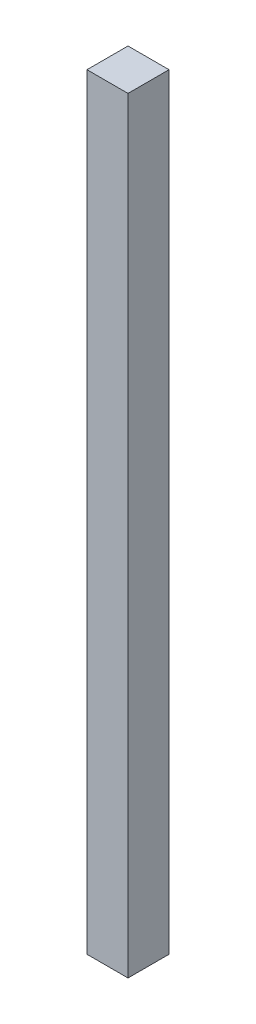
ISO-10303-21;
HEADER;
FILE_DESCRIPTION(('STEP AP214'),'2;1');
FILE_NAME('part.step','',(''),(''),'','','');
FILE_SCHEMA(('AUTOMOTIVE_DESIGN { 1 0 10303 214 1 1 1 1 }'));
ENDSEC;
DATA;
#1=APPLICATION_CONTEXT('core data for automotive mechanical design processes');
#2=APPLICATION_PROTOCOL_DEFINITION('international standard','automotive_design',2000,#1);
#3=PRODUCT_CONTEXT('',#1,'mechanical');
#4=PRODUCT('Part','Part','',(#3));
#5=PRODUCT_RELATED_PRODUCT_CATEGORY('part','',(#4));
#6=PRODUCT_DEFINITION_FORMATION('','',#4);
#7=PRODUCT_DEFINITION_CONTEXT('part definition',#1,'design');
#8=PRODUCT_DEFINITION('design','',#6,#7);
#9=PRODUCT_DEFINITION_SHAPE('','',#8);
#10=(LENGTH_UNIT() NAMED_UNIT(*) SI_UNIT(.MILLI.,.METRE.));
#11=(NAMED_UNIT(*) PLANE_ANGLE_UNIT() SI_UNIT($,.RADIAN.));
#12=(NAMED_UNIT(*) SI_UNIT($,.STERADIAN.) SOLID_ANGLE_UNIT());
#13=UNCERTAINTY_MEASURE_WITH_UNIT(LENGTH_MEASURE(1.E-05),#10,'distance_accuracy_value','');
#14=(GEOMETRIC_REPRESENTATION_CONTEXT(3) GLOBAL_UNCERTAINTY_ASSIGNED_CONTEXT((#13)) GLOBAL_UNIT_ASSIGNED_CONTEXT((#10,
#11,#12)) REPRESENTATION_CONTEXT('',''));
#15=CARTESIAN_POINT('',(0.,0.,0.));
#16=DIRECTION('',(0.,0.,1.));
#17=DIRECTION('',(1.,0.,0.));
#18=AXIS2_PLACEMENT_3D('',#15,#16,#17);
#19=CARTESIAN_POINT('',(-19.05,711.2,19.05));
#20=DIRECTION('',(1.,0.,0.));
#21=DIRECTION('',(0.,0.,-1.));
#22=AXIS2_PLACEMENT_3D('',#19,#20,#21);
#23=PLANE('',#22);
#24=DIRECTION('',(0.,0.,1.));
#25=VECTOR('',#24,1.);
#26=CARTESIAN_POINT('',(-19.05,0.,19.05));
#27=LINE('',#26,#25);
#28=CARTESIAN_POINT('',(-19.05,0.,-19.05));
#29=VERTEX_POINT('',#28);
#30=CARTESIAN_POINT('',(-19.05,0.,19.05));
#31=VERTEX_POINT('',#30);
#32=EDGE_CURVE('E95',#29,#31,#27,.T.);
#33=ORIENTED_EDGE('',*,*,#32,.T.);
#34=DIRECTION('',(0.,-1.,0.));
#35=VECTOR('',#34,1.);
#36=CARTESIAN_POINT('',(-19.05,711.2,19.05));
#37=LINE('',#36,#35);
#38=CARTESIAN_POINT('',(-19.05,711.2,19.05));
#39=VERTEX_POINT('',#38);
#40=EDGE_CURVE('E11',#39,#31,#37,.T.);
#41=ORIENTED_EDGE('',*,*,#40,.F.);
#42=DIRECTION('',(0.,0.,1.));
#43=VECTOR('',#42,1.);
#44=CARTESIAN_POINT('',(-19.05,711.2,19.05));
#45=LINE('',#44,#43);
#46=CARTESIAN_POINT('',(-19.05,711.2,-19.05));
#47=VERTEX_POINT('',#46);
#48=EDGE_CURVE('E83',#47,#39,#45,.T.);
#49=ORIENTED_EDGE('',*,*,#48,.F.);
#50=DIRECTION('',(0.,-1.,0.));
#51=VECTOR('',#50,1.);
#52=CARTESIAN_POINT('',(-19.05,711.2,-19.05));
#53=LINE('',#52,#51);
#54=EDGE_CURVE('E91',#47,#29,#53,.T.);
#55=ORIENTED_EDGE('',*,*,#54,.T.);
#56=EDGE_LOOP('',(#33,#41,#49,#55));
#57=FACE_BOUND('',#56,.T.);
#58=ADVANCED_FACE('F32',(#57),#23,.F.);
#59=CARTESIAN_POINT('',(19.05,711.2,19.05));
#60=DIRECTION('',(0.,0.,-1.));
#61=DIRECTION('',(-1.,0.,0.));
#62=AXIS2_PLACEMENT_3D('',#59,#60,#61);
#63=PLANE('',#62);
#64=DIRECTION('',(1.,0.,0.));
#65=VECTOR('',#64,1.);
#66=CARTESIAN_POINT('',(19.05,0.,19.05));
#67=LINE('',#66,#65);
#68=CARTESIAN_POINT('',(19.05,0.,19.05));
#69=VERTEX_POINT('',#68);
#70=EDGE_CURVE('E87',#31,#69,#67,.T.);
#71=ORIENTED_EDGE('',*,*,#70,.T.);
#72=DIRECTION('',(0.,-1.,0.));
#73=VECTOR('',#72,1.);
#74=CARTESIAN_POINT('',(19.05,711.2,19.05));
#75=LINE('',#74,#73);
#76=CARTESIAN_POINT('',(19.05,711.2,19.05));
#77=VERTEX_POINT('',#76);
#78=EDGE_CURVE('E40',#77,#69,#75,.T.);
#79=ORIENTED_EDGE('',*,*,#78,.F.);
#80=DIRECTION('',(1.,0.,0.));
#81=VECTOR('',#80,1.);
#82=CARTESIAN_POINT('',(19.05,711.2,19.05));
#83=LINE('',#82,#81);
#84=EDGE_CURVE('E78',#39,#77,#83,.T.);
#85=ORIENTED_EDGE('',*,*,#84,.F.);
#86=ORIENTED_EDGE('',*,*,#40,.T.);
#87=EDGE_LOOP('',(#71,#79,#85,#86));
#88=FACE_BOUND('',#87,.T.);
#89=ADVANCED_FACE('F86',(#88),#63,.F.);
#90=CARTESIAN_POINT('',(19.05,711.2,19.05));
#91=DIRECTION('',(-1.,0.,0.));
#92=DIRECTION('',(0.,0.,1.));
#93=AXIS2_PLACEMENT_3D('',#90,#91,#92);
#94=PLANE('',#93);
#95=DIRECTION('',(0.,0.,-1.));
#96=VECTOR('',#95,1.);
#97=CARTESIAN_POINT('',(19.05,0.,19.05));
#98=LINE('',#97,#96);
#99=CARTESIAN_POINT('',(19.05,0.,-19.05));
#100=VERTEX_POINT('',#99);
#101=EDGE_CURVE('E65',#69,#100,#98,.T.);
#102=ORIENTED_EDGE('',*,*,#101,.T.);
#103=DIRECTION('',(0.,-1.,0.));
#104=VECTOR('',#103,1.);
#105=CARTESIAN_POINT('',(19.05,711.2,-19.05));
#106=LINE('',#105,#104);
#107=CARTESIAN_POINT('',(19.05,711.2,-19.05));
#108=VERTEX_POINT('',#107);
#109=EDGE_CURVE('E88',#108,#100,#106,.T.);
#110=ORIENTED_EDGE('',*,*,#109,.F.);
#111=DIRECTION('',(0.,0.,-1.));
#112=VECTOR('',#111,1.);
#113=CARTESIAN_POINT('',(19.05,711.2,19.05));
#114=LINE('',#113,#112);
#115=EDGE_CURVE('E81',#77,#108,#114,.T.);
#116=ORIENTED_EDGE('',*,*,#115,.F.);
#117=ORIENTED_EDGE('',*,*,#78,.T.);
#118=EDGE_LOOP('',(#102,#110,#116,#117));
#119=FACE_BOUND('',#118,.T.);
#120=ADVANCED_FACE('F89',(#119),#94,.F.);
#121=CARTESIAN_POINT('',(19.05,711.2,-19.05));
#122=DIRECTION('',(0.,0.,1.));
#123=DIRECTION('',(1.,0.,0.));
#124=AXIS2_PLACEMENT_3D('',#121,#122,#123);
#125=PLANE('',#124);
#126=DIRECTION('',(-1.,0.,0.));
#127=VECTOR('',#126,1.);
#128=CARTESIAN_POINT('',(19.05,0.,-19.05));
#129=LINE('',#128,#127);
#130=EDGE_CURVE('E71',#100,#29,#129,.T.);
#131=ORIENTED_EDGE('',*,*,#130,.T.);
#132=ORIENTED_EDGE('',*,*,#54,.F.);
#133=DIRECTION('',(-1.,0.,0.));
#134=VECTOR('',#133,1.);
#135=CARTESIAN_POINT('',(19.05,711.2,-19.05));
#136=LINE('',#135,#134);
#137=EDGE_CURVE('E48',#108,#47,#136,.T.);
#138=ORIENTED_EDGE('',*,*,#137,.F.);
#139=ORIENTED_EDGE('',*,*,#109,.T.);
#140=EDGE_LOOP('',(#131,#132,#138,#139));
#141=FACE_BOUND('',#140,.T.);
#142=ADVANCED_FACE('F102',(#141),#125,.F.);
#143=CARTESIAN_POINT('',(0.,711.2,0.));
#144=DIRECTION('',(0.,1.,0.));
#145=DIRECTION('',(0.,0.,1.));
#146=AXIS2_PLACEMENT_3D('',#143,#144,#145);
#147=PLANE('',#146);
#148=ORIENTED_EDGE('',*,*,#48,.T.);
#149=ORIENTED_EDGE('',*,*,#84,.T.);
#150=ORIENTED_EDGE('',*,*,#115,.T.);
#151=ORIENTED_EDGE('',*,*,#137,.T.);
#152=EDGE_LOOP('',(#148,#149,#150,#151));
#153=FACE_BOUND('',#152,.T.);
#154=ADVANCED_FACE('F79',(#153),#147,.T.);
#155=CARTESIAN_POINT('',(0.,0.,0.));
#156=DIRECTION('',(0.,1.,0.));
#157=DIRECTION('',(0.,0.,1.));
#158=AXIS2_PLACEMENT_3D('',#155,#156,#157);
#159=PLANE('',#158);
#160=ORIENTED_EDGE('',*,*,#32,.F.);
#161=ORIENTED_EDGE('',*,*,#130,.F.);
#162=ORIENTED_EDGE('',*,*,#101,.F.);
#163=ORIENTED_EDGE('',*,*,#70,.F.);
#164=EDGE_LOOP('',(#160,#161,#162,#163));
#165=FACE_BOUND('',#164,.T.);
#166=ADVANCED_FACE('F105',(#165),#159,.F.);
#167=CLOSED_SHELL('',(#58,#89,#120,#142,#154,#166));
#168=MANIFOLD_SOLID_BREP('B2',#167);
#169=ADVANCED_BREP_SHAPE_REPRESENTATION('',(#18,#168),#14);
#170=SHAPE_DEFINITION_REPRESENTATION(#9,#169);
ENDSEC;
END-ISO-10303-21;
